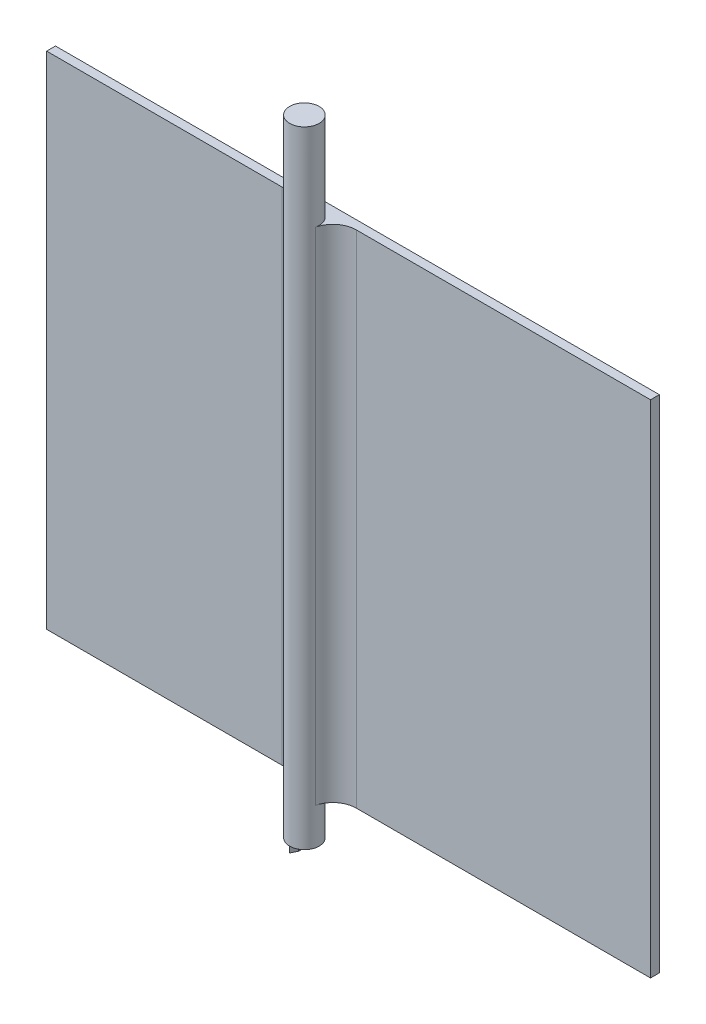
ISO-10303-21;
HEADER;
FILE_DESCRIPTION(('STEP AP214'),'2;1');
FILE_NAME('part.step','',(''),(''),'','','');
FILE_SCHEMA(('AUTOMOTIVE_DESIGN { 1 0 10303 214 1 1 1 1 }'));
ENDSEC;
DATA;
#1=APPLICATION_CONTEXT('core data for automotive mechanical design processes');
#2=APPLICATION_PROTOCOL_DEFINITION('international standard','automotive_design',2000,#1);
#3=PRODUCT_CONTEXT('',#1,'mechanical');
#4=PRODUCT('Part','Part','',(#3));
#5=PRODUCT_RELATED_PRODUCT_CATEGORY('part','',(#4));
#6=PRODUCT_DEFINITION_FORMATION('','',#4);
#7=PRODUCT_DEFINITION_CONTEXT('part definition',#1,'design');
#8=PRODUCT_DEFINITION('design','',#6,#7);
#9=PRODUCT_DEFINITION_SHAPE('','',#8);
#10=(LENGTH_UNIT() NAMED_UNIT(*) SI_UNIT(.MILLI.,.METRE.));
#11=(NAMED_UNIT(*) PLANE_ANGLE_UNIT() SI_UNIT($,.RADIAN.));
#12=(NAMED_UNIT(*) SI_UNIT($,.STERADIAN.) SOLID_ANGLE_UNIT());
#13=UNCERTAINTY_MEASURE_WITH_UNIT(LENGTH_MEASURE(1.E-05),#10,'distance_accuracy_value','');
#14=(GEOMETRIC_REPRESENTATION_CONTEXT(3) GLOBAL_UNCERTAINTY_ASSIGNED_CONTEXT((#13)) GLOBAL_UNIT_ASSIGNED_CONTEXT((#10,
#11,#12)) REPRESENTATION_CONTEXT('',''));
#15=CARTESIAN_POINT('',(0.,0.,0.));
#16=DIRECTION('',(0.,0.,1.));
#17=DIRECTION('',(1.,0.,0.));
#18=AXIS2_PLACEMENT_3D('',#15,#16,#17);
#19=CARTESIAN_POINT('',(92.5,-12.5,8.));
#20=DIRECTION('',(0.,-1.,0.));
#21=DIRECTION('',(0.,0.,-1.));
#22=AXIS2_PLACEMENT_3D('',#19,#20,#21);
#23=PLANE('',#22);
#24=DIRECTION('',(0.,0.,-1.));
#25=VECTOR('',#24,1.);
#26=CARTESIAN_POINT('',(91.5,-12.5,0.));
#27=LINE('',#26,#25);
#28=CARTESIAN_POINT('',(91.5,-12.5,11.));
#29=VERTEX_POINT('',#28);
#30=CARTESIAN_POINT('',(91.5,-12.5,5.));
#31=VERTEX_POINT('',#30);
#32=EDGE_CURVE('E207',#29,#31,#27,.T.);
#33=ORIENTED_EDGE('',*,*,#32,.F.);
#34=DIRECTION('',(0.447213595499958,0.,0.894427190999916));
#35=VECTOR('',#34,1.);
#36=CARTESIAN_POINT('',(68.8,-12.5,-34.4));
#37=LINE('',#36,#35);
#38=CARTESIAN_POINT('',(92.5,-12.5,13.));
#39=VERTEX_POINT('',#38);
#40=EDGE_CURVE('E204',#29,#39,#37,.T.);
#41=ORIENTED_EDGE('',*,*,#40,.T.);
#42=CARTESIAN_POINT('',(92.5,-12.5,8.));
#43=DIRECTION('',(0.,-1.,0.));
#44=DIRECTION('',(0.,0.,-1.));
#45=AXIS2_PLACEMENT_3D('',#42,#43,#44);
#46=CIRCLE('',#45,5.);
#47=CARTESIAN_POINT('',(92.5,-12.5,3.));
#48=VERTEX_POINT('',#47);
#49=EDGE_CURVE('E247',#39,#48,#46,.T.);
#50=ORIENTED_EDGE('',*,*,#49,.T.);
#51=DIRECTION('',(0.447213595499957,0.,-0.894427190999916));
#52=VECTOR('',#51,1.);
#53=CARTESIAN_POINT('',(75.2,-12.5,37.6));
#54=LINE('',#53,#52);
#55=EDGE_CURVE('E211',#31,#48,#54,.T.);
#56=ORIENTED_EDGE('',*,*,#55,.F.);
#57=EDGE_LOOP('',(#33,#41,#50,#56));
#58=FACE_BOUND('',#57,.T.);
#59=ADVANCED_FACE('F47',(#58),#23,.T.);
#60=EDGE_CURVE('E248',#48,#39,#46,.T.);
#61=ORIENTED_EDGE('',*,*,#60,.T.);
#62=DIRECTION('',(0.447213595499958,0.,-0.894427190999916));
#63=VECTOR('',#62,1.);
#64=CARTESIAN_POINT('',(79.2,-12.5,39.6));
#65=LINE('',#64,#63);
#66=CARTESIAN_POINT('',(93.5,-12.5,11.));
#67=VERTEX_POINT('',#66);
#68=EDGE_CURVE('E186',#39,#67,#65,.T.);
#69=ORIENTED_EDGE('',*,*,#68,.T.);
#70=DIRECTION('',(0.,0.,-1.));
#71=VECTOR('',#70,1.);
#72=CARTESIAN_POINT('',(93.5,-12.5,0.));
#73=LINE('',#72,#71);
#74=CARTESIAN_POINT('',(93.5,-12.5,5.));
#75=VERTEX_POINT('',#74);
#76=EDGE_CURVE('E219',#67,#75,#73,.T.);
#77=ORIENTED_EDGE('',*,*,#76,.T.);
#78=DIRECTION('',(0.447213595499957,0.,0.894427190999916));
#79=VECTOR('',#78,1.);
#80=CARTESIAN_POINT('',(72.8000000000001,-12.5,-36.4));
#81=LINE('',#80,#79);
#82=EDGE_CURVE('E215',#48,#75,#81,.T.);
#83=ORIENTED_EDGE('',*,*,#82,.F.);
#84=EDGE_LOOP('',(#61,#69,#77,#83));
#85=FACE_BOUND('',#84,.T.);
#86=ADVANCED_FACE('F344',(#85),#23,.T.);
#87=CARTESIAN_POINT('',(0.,170.,3.));
#88=DIRECTION('',(0.,-1.,0.));
#89=DIRECTION('',(0.,0.,-1.));
#90=AXIS2_PLACEMENT_3D('',#87,#88,#89);
#91=PLANE('',#90);
#92=CARTESIAN_POINT('',(92.5,170.,8.));
#93=DIRECTION('',(0.,1.,0.));
#94=DIRECTION('',(0.,0.,1.));
#95=AXIS2_PLACEMENT_3D('',#92,#93,#94);
#96=CIRCLE('',#95,5.);
#97=CARTESIAN_POINT('',(97.3650425541052,170.,9.15384615384615));
#98=VERTEX_POINT('',#97);
#99=CARTESIAN_POINT('',(87.6349574458948,170.,9.15384615384615));
#100=VERTEX_POINT('',#99);
#101=EDGE_CURVE('E252',#98,#100,#96,.T.);
#102=ORIENTED_EDGE('',*,*,#101,.F.);
#103=CARTESIAN_POINT('',(105.149110640674,170.,11.));
#104=DIRECTION('',(0.,-1.,0.));
#105=DIRECTION('',(0.,0.,-1.));
#106=AXIS2_PLACEMENT_3D('',#103,#104,#105);
#107=CIRCLE('',#106,8.);
#108=CARTESIAN_POINT('',(105.149110640674,170.,3.));
#109=VERTEX_POINT('',#108);
#110=EDGE_CURVE('E299',#98,#109,#107,.T.);
#111=ORIENTED_EDGE('',*,*,#110,.T.);
#112=DIRECTION('',(-1.,0.,0.));
#113=VECTOR('',#112,1.);
#114=CARTESIAN_POINT('',(0.,170.,3.));
#115=LINE('',#114,#113);
#116=CARTESIAN_POINT('',(205.,170.,3.));
#117=VERTEX_POINT('',#116);
#118=EDGE_CURVE('E272',#117,#109,#115,.T.);
#119=ORIENTED_EDGE('',*,*,#118,.F.);
#120=DIRECTION('',(0.,0.,-1.));
#121=VECTOR('',#120,1.);
#122=CARTESIAN_POINT('',(205.,170.,3.));
#123=LINE('',#122,#121);
#124=CARTESIAN_POINT('',(205.,170.,0.));
#125=VERTEX_POINT('',#124);
#126=EDGE_CURVE('E178',#117,#125,#123,.T.);
#127=ORIENTED_EDGE('',*,*,#126,.T.);
#128=DIRECTION('',(-1.,0.,0.));
#129=VECTOR('',#128,1.);
#130=CARTESIAN_POINT('',(0.,170.,0.));
#131=LINE('',#130,#129);
#132=CARTESIAN_POINT('',(0.,170.,0.));
#133=VERTEX_POINT('',#132);
#134=EDGE_CURVE('E159',#125,#133,#131,.T.);
#135=ORIENTED_EDGE('',*,*,#134,.T.);
#136=DIRECTION('',(0.,0.,-1.));
#137=VECTOR('',#136,1.);
#138=CARTESIAN_POINT('',(0.,170.,3.));
#139=LINE('',#138,#137);
#140=CARTESIAN_POINT('',(0.,170.,3.));
#141=VERTEX_POINT('',#140);
#142=EDGE_CURVE('E276',#141,#133,#139,.T.);
#143=ORIENTED_EDGE('',*,*,#142,.F.);
#144=CARTESIAN_POINT('',(79.8508893593265,170.,3.));
#145=VERTEX_POINT('',#144);
#146=EDGE_CURVE('E271',#145,#141,#115,.T.);
#147=ORIENTED_EDGE('',*,*,#146,.F.);
#148=CARTESIAN_POINT('',(79.8508893593265,170.,11.));
#149=DIRECTION('',(0.,-1.,0.));
#150=DIRECTION('',(0.,0.,-1.));
#151=AXIS2_PLACEMENT_3D('',#148,#149,#150);
#152=CIRCLE('',#151,8.);
#153=EDGE_CURVE('E56',#145,#100,#152,.T.);
#154=ORIENTED_EDGE('',*,*,#153,.T.);
#155=EDGE_LOOP('',(#102,#111,#119,#127,#135,#143,#147,#154));
#156=FACE_BOUND('',#155,.T.);
#157=ADVANCED_FACE('F308',(#156),#91,.F.);
#158=CARTESIAN_POINT('',(0.,0.,3.));
#159=DIRECTION('',(0.,0.,-1.));
#160=DIRECTION('',(-1.,0.,0.));
#161=AXIS2_PLACEMENT_3D('',#158,#159,#160);
#162=PLANE('',#161);
#163=ORIENTED_EDGE('',*,*,#118,.T.);
#164=DIRECTION('',(0.,1.,0.));
#165=VECTOR('',#164,1.);
#166=CARTESIAN_POINT('',(105.149110640674,0.,3.));
#167=LINE('',#166,#165);
#168=CARTESIAN_POINT('',(105.149110640674,0.,3.));
#169=VERTEX_POINT('',#168);
#170=EDGE_CURVE('E293',#109,#169,#167,.F.);
#171=ORIENTED_EDGE('',*,*,#170,.T.);
#172=DIRECTION('',(1.,0.,0.));
#173=VECTOR('',#172,1.);
#174=CARTESIAN_POINT('',(0.,0.,3.));
#175=LINE('',#174,#173);
#176=CARTESIAN_POINT('',(205.,0.,3.));
#177=VERTEX_POINT('',#176);
#178=EDGE_CURVE('E267',#169,#177,#175,.T.);
#179=ORIENTED_EDGE('',*,*,#178,.T.);
#180=DIRECTION('',(0.,-1.,0.));
#181=VECTOR('',#180,1.);
#182=CARTESIAN_POINT('',(205.,190.223748416157,3.));
#183=LINE('',#182,#181);
#184=EDGE_CURVE('E169',#117,#177,#183,.T.);
#185=ORIENTED_EDGE('',*,*,#184,.F.);
#186=EDGE_LOOP('',(#163,#171,#179,#185));
#187=FACE_BOUND('',#186,.T.);
#188=ADVANCED_FACE('F320',(#187),#162,.F.);
#189=CARTESIAN_POINT('',(0.,0.,3.));
#190=DIRECTION('',(1.,0.,0.));
#191=DIRECTION('',(0.,0.,-1.));
#192=AXIS2_PLACEMENT_3D('',#189,#190,#191);
#193=PLANE('',#192);
#194=DIRECTION('',(0.,-1.,0.));
#195=VECTOR('',#194,1.);
#196=CARTESIAN_POINT('',(0.,0.,0.));
#197=LINE('',#196,#195);
#198=CARTESIAN_POINT('',(0.,0.,0.));
#199=VERTEX_POINT('',#198);
#200=EDGE_CURVE('E160',#133,#199,#197,.T.);
#201=ORIENTED_EDGE('',*,*,#200,.T.);
#202=DIRECTION('',(0.,0.,-1.));
#203=VECTOR('',#202,1.);
#204=CARTESIAN_POINT('',(0.,0.,3.));
#205=LINE('',#204,#203);
#206=CARTESIAN_POINT('',(0.,0.,3.));
#207=VERTEX_POINT('',#206);
#208=EDGE_CURVE('E154',#207,#199,#205,.T.);
#209=ORIENTED_EDGE('',*,*,#208,.F.);
#210=DIRECTION('',(0.,-1.,0.));
#211=VECTOR('',#210,1.);
#212=CARTESIAN_POINT('',(0.,0.,3.));
#213=LINE('',#212,#211);
#214=EDGE_CURVE('E263',#141,#207,#213,.T.);
#215=ORIENTED_EDGE('',*,*,#214,.F.);
#216=ORIENTED_EDGE('',*,*,#142,.T.);
#217=EDGE_LOOP('',(#201,#209,#215,#216));
#218=FACE_BOUND('',#217,.T.);
#219=ADVANCED_FACE('F328',(#218),#193,.F.);
#220=CARTESIAN_POINT('',(0.,0.,3.));
#221=DIRECTION('',(0.,1.,0.));
#222=DIRECTION('',(0.,0.,1.));
#223=AXIS2_PLACEMENT_3D('',#220,#221,#222);
#224=PLANE('',#223);
#225=CARTESIAN_POINT('',(92.5,0.,8.));
#226=DIRECTION('',(0.,-1.,0.));
#227=DIRECTION('',(0.,0.,-1.));
#228=AXIS2_PLACEMENT_3D('',#225,#226,#227);
#229=CIRCLE('',#228,5.);
#230=CARTESIAN_POINT('',(87.6349574458948,0.,9.15384615384615));
#231=VERTEX_POINT('',#230);
#232=CARTESIAN_POINT('',(97.3650425541052,0.,9.15384615384615));
#233=VERTEX_POINT('',#232);
#234=EDGE_CURVE('E253',#231,#233,#229,.T.);
#235=ORIENTED_EDGE('',*,*,#234,.F.);
#236=CARTESIAN_POINT('',(79.8508893593265,0.,11.));
#237=DIRECTION('',(0.,1.,0.));
#238=DIRECTION('',(0.,0.,1.));
#239=AXIS2_PLACEMENT_3D('',#236,#237,#238);
#240=CIRCLE('',#239,8.);
#241=CARTESIAN_POINT('',(79.8508893593265,0.,3.));
#242=VERTEX_POINT('',#241);
#243=EDGE_CURVE('E11',#231,#242,#240,.T.);
#244=ORIENTED_EDGE('',*,*,#243,.T.);
#245=EDGE_CURVE('E268',#207,#242,#175,.T.);
#246=ORIENTED_EDGE('',*,*,#245,.F.);
#247=ORIENTED_EDGE('',*,*,#208,.T.);
#248=DIRECTION('',(1.,0.,0.));
#249=VECTOR('',#248,1.);
#250=CARTESIAN_POINT('',(0.,0.,0.));
#251=LINE('',#250,#249);
#252=CARTESIAN_POINT('',(205.,0.,0.));
#253=VERTEX_POINT('',#252);
#254=EDGE_CURVE('E147',#199,#253,#251,.T.);
#255=ORIENTED_EDGE('',*,*,#254,.T.);
#256=DIRECTION('',(0.,0.,1.));
#257=VECTOR('',#256,1.);
#258=CARTESIAN_POINT('',(205.,0.,3.));
#259=LINE('',#258,#257);
#260=EDGE_CURVE('E152',#253,#177,#259,.T.);
#261=ORIENTED_EDGE('',*,*,#260,.T.);
#262=ORIENTED_EDGE('',*,*,#178,.F.);
#263=CARTESIAN_POINT('',(105.149110640674,0.,11.));
#264=DIRECTION('',(0.,1.,0.));
#265=DIRECTION('',(0.,0.,1.));
#266=AXIS2_PLACEMENT_3D('',#263,#264,#265);
#267=CIRCLE('',#266,8.);
#268=EDGE_CURVE('E302',#169,#233,#267,.T.);
#269=ORIENTED_EDGE('',*,*,#268,.T.);
#270=EDGE_LOOP('',(#235,#244,#246,#247,#255,#261,#262,#269));
#271=FACE_BOUND('',#270,.T.);
#272=ADVANCED_FACE('F149',(#271),#224,.F.);
#273=ORIENTED_EDGE('',*,*,#245,.T.);
#274=DIRECTION('',(0.,1.,0.));
#275=VECTOR('',#274,1.);
#276=CARTESIAN_POINT('',(79.8508893593265,0.,3.));
#277=LINE('',#276,#275);
#278=EDGE_CURVE('E296',#242,#145,#277,.T.);
#279=ORIENTED_EDGE('',*,*,#278,.T.);
#280=ORIENTED_EDGE('',*,*,#146,.T.);
#281=ORIENTED_EDGE('',*,*,#214,.T.);
#282=EDGE_LOOP('',(#273,#279,#280,#281));
#283=FACE_BOUND('',#282,.T.);
#284=ADVANCED_FACE('F330',(#283),#162,.F.);
#285=CARTESIAN_POINT('',(0.,0.,0.));
#286=DIRECTION('',(0.,0.,-1.));
#287=DIRECTION('',(-1.,0.,0.));
#288=AXIS2_PLACEMENT_3D('',#285,#286,#287);
#289=PLANE('',#288);
#290=ORIENTED_EDGE('',*,*,#200,.F.);
#291=ORIENTED_EDGE('',*,*,#134,.F.);
#292=DIRECTION('',(0.,-1.,0.));
#293=VECTOR('',#292,1.);
#294=CARTESIAN_POINT('',(205.,190.223748416157,0.));
#295=LINE('',#294,#293);
#296=EDGE_CURVE('E163',#125,#253,#295,.T.);
#297=ORIENTED_EDGE('',*,*,#296,.T.);
#298=ORIENTED_EDGE('',*,*,#254,.F.);
#299=EDGE_LOOP('',(#290,#291,#297,#298));
#300=FACE_BOUND('',#299,.T.);
#301=ADVANCED_FACE('F164',(#300),#289,.T.);
#302=CARTESIAN_POINT('',(92.5,-14.142135623731,8.));
#303=DIRECTION('',(0.,1.,0.));
#304=DIRECTION('',(0.,0.,1.));
#305=AXIS2_PLACEMENT_3D('',#302,#303,#304);
#306=CYLINDRICAL_SURFACE('',#305,5.);
#307=DIRECTION('',(0.,1.,0.));
#308=VECTOR('',#307,1.);
#309=CARTESIAN_POINT('',(97.3650425541052,-14.142135623731,9.15384615384616));
#310=LINE('',#309,#308);
#311=EDGE_CURVE('E289',#233,#98,#310,.T.);
#312=ORIENTED_EDGE('',*,*,#311,.T.);
#313=ORIENTED_EDGE('',*,*,#101,.T.);
#314=DIRECTION('',(0.,1.,0.));
#315=VECTOR('',#314,1.);
#316=CARTESIAN_POINT('',(87.6349574458948,-14.142135623731,9.15384615384616));
#317=LINE('',#316,#315);
#318=EDGE_CURVE('E256',#100,#231,#317,.F.);
#319=ORIENTED_EDGE('',*,*,#318,.T.);
#320=ORIENTED_EDGE('',*,*,#234,.T.);
#321=EDGE_LOOP('',(#312,#313,#319,#320));
#322=FACE_BOUND('',#321,.T.);
#323=CARTESIAN_POINT('',(92.5,200.,8.));
#324=DIRECTION('',(0.,1.,0.));
#325=DIRECTION('',(0.,0.,1.));
#326=AXIS2_PLACEMENT_3D('',#323,#324,#325);
#327=CIRCLE('',#326,5.);
#328=CARTESIAN_POINT('',(92.5,200.,13.));
#329=VERTEX_POINT('',#328);
#330=EDGE_CURVE('E257',#329,#329,#327,.T.);
#331=ORIENTED_EDGE('',*,*,#330,.F.);
#332=EDGE_LOOP('',(#331));
#333=FACE_BOUND('',#332,.T.);
#334=ORIENTED_EDGE('',*,*,#60,.F.);
#335=ORIENTED_EDGE('',*,*,#49,.F.);
#336=EDGE_LOOP('',(#334,#335));
#337=FACE_BOUND('',#336,.T.);
#338=ADVANCED_FACE('F312',(#322,#333,#337),#306,.T.);
#339=CARTESIAN_POINT('',(92.5,200.,8.));
#340=DIRECTION('',(0.,1.,0.));
#341=DIRECTION('',(0.,0.,1.));
#342=AXIS2_PLACEMENT_3D('',#339,#340,#341);
#343=PLANE('',#342);
#344=ORIENTED_EDGE('',*,*,#330,.T.);
#345=EDGE_LOOP('',(#344));
#346=FACE_BOUND('',#345,.T.);
#347=ADVANCED_FACE('F356',(#346),#343,.T.);
#348=CARTESIAN_POINT('',(68.8,-14.5,-34.4));
#349=DIRECTION('',(-0.894427190999916,0.,0.447213595499958));
#350=DIRECTION('',(0.447213595499958,0.,0.894427190999916));
#351=AXIS2_PLACEMENT_3D('',#348,#349,#350);
#352=PLANE('',#351);
#353=ORIENTED_EDGE('',*,*,#40,.F.);
#354=DIRECTION('',(0.,1.,0.));
#355=VECTOR('',#354,1.);
#356=CARTESIAN_POINT('',(91.5,-14.5,11.));
#357=LINE('',#356,#355);
#358=CARTESIAN_POINT('',(91.5,-14.5,11.));
#359=VERTEX_POINT('',#358);
#360=EDGE_CURVE('E243',#359,#29,#357,.T.);
#361=ORIENTED_EDGE('',*,*,#360,.F.);
#362=DIRECTION('',(0.447213595499958,0.,0.894427190999916));
#363=VECTOR('',#362,1.);
#364=CARTESIAN_POINT('',(68.8,-14.5,-34.4));
#365=LINE('',#364,#363);
#366=CARTESIAN_POINT('',(92.5,-14.5,13.));
#367=VERTEX_POINT('',#366);
#368=EDGE_CURVE('E181',#359,#367,#365,.T.);
#369=ORIENTED_EDGE('',*,*,#368,.T.);
#370=DIRECTION('',(0.,1.,0.));
#371=VECTOR('',#370,1.);
#372=CARTESIAN_POINT('',(92.5,-14.5,13.));
#373=LINE('',#372,#371);
#374=EDGE_CURVE('E203',#367,#39,#373,.T.);
#375=ORIENTED_EDGE('',*,*,#374,.T.);
#376=EDGE_LOOP('',(#353,#361,#369,#375));
#377=FACE_BOUND('',#376,.T.);
#378=ADVANCED_FACE('F354',(#377),#352,.T.);
#379=CARTESIAN_POINT('',(91.5,-14.5,0.));
#380=DIRECTION('',(1.,0.,0.));
#381=DIRECTION('',(0.,0.,-1.));
#382=AXIS2_PLACEMENT_3D('',#379,#380,#381);
#383=PLANE('',#382);
#384=ORIENTED_EDGE('',*,*,#32,.T.);
#385=DIRECTION('',(0.,1.,0.));
#386=VECTOR('',#385,1.);
#387=CARTESIAN_POINT('',(91.5,-14.5,5.));
#388=LINE('',#387,#386);
#389=CARTESIAN_POINT('',(91.5,-14.5,5.));
#390=VERTEX_POINT('',#389);
#391=EDGE_CURVE('E239',#390,#31,#388,.T.);
#392=ORIENTED_EDGE('',*,*,#391,.F.);
#393=DIRECTION('',(0.,0.,-1.));
#394=VECTOR('',#393,1.);
#395=CARTESIAN_POINT('',(91.5,-14.5,0.));
#396=LINE('',#395,#394);
#397=EDGE_CURVE('E185',#359,#390,#396,.T.);
#398=ORIENTED_EDGE('',*,*,#397,.F.);
#399=ORIENTED_EDGE('',*,*,#360,.T.);
#400=EDGE_LOOP('',(#384,#392,#398,#399));
#401=FACE_BOUND('',#400,.T.);
#402=ADVANCED_FACE('F450',(#401),#383,.F.);
#403=CARTESIAN_POINT('',(75.2,-14.5,37.6));
#404=DIRECTION('',(0.894427190999916,0.,0.447213595499957));
#405=DIRECTION('',(0.447213595499957,0.,-0.894427190999916));
#406=AXIS2_PLACEMENT_3D('',#403,#404,#405);
#407=PLANE('',#406);
#408=ORIENTED_EDGE('',*,*,#55,.T.);
#409=DIRECTION('',(0.,1.,0.));
#410=VECTOR('',#409,1.);
#411=CARTESIAN_POINT('',(92.5,-14.5,3.));
#412=LINE('',#411,#410);
#413=CARTESIAN_POINT('',(92.5,-14.5,3.));
#414=VERTEX_POINT('',#413);
#415=EDGE_CURVE('E235',#414,#48,#412,.T.);
#416=ORIENTED_EDGE('',*,*,#415,.F.);
#417=DIRECTION('',(0.447213595499957,0.,-0.894427190999916));
#418=VECTOR('',#417,1.);
#419=CARTESIAN_POINT('',(75.2,-14.5,37.6));
#420=LINE('',#419,#418);
#421=EDGE_CURVE('E189',#390,#414,#420,.T.);
#422=ORIENTED_EDGE('',*,*,#421,.F.);
#423=ORIENTED_EDGE('',*,*,#391,.T.);
#424=EDGE_LOOP('',(#408,#416,#422,#423));
#425=FACE_BOUND('',#424,.T.);
#426=ADVANCED_FACE('F441',(#425),#407,.F.);
#427=CARTESIAN_POINT('',(72.8000000000001,-14.5,-36.4));
#428=DIRECTION('',(-0.894427190999916,0.,0.447213595499957));
#429=DIRECTION('',(0.447213595499957,0.,0.894427190999916));
#430=AXIS2_PLACEMENT_3D('',#427,#428,#429);
#431=PLANE('',#430);
#432=ORIENTED_EDGE('',*,*,#82,.T.);
#433=DIRECTION('',(0.,1.,0.));
#434=VECTOR('',#433,1.);
#435=CARTESIAN_POINT('',(93.5,-14.5,5.));
#436=LINE('',#435,#434);
#437=CARTESIAN_POINT('',(93.5,-14.5,5.));
#438=VERTEX_POINT('',#437);
#439=EDGE_CURVE('E231',#438,#75,#436,.T.);
#440=ORIENTED_EDGE('',*,*,#439,.F.);
#441=DIRECTION('',(0.447213595499957,0.,0.894427190999916));
#442=VECTOR('',#441,1.);
#443=CARTESIAN_POINT('',(72.8000000000001,-14.5,-36.4));
#444=LINE('',#443,#442);
#445=EDGE_CURVE('E192',#414,#438,#444,.T.);
#446=ORIENTED_EDGE('',*,*,#445,.F.);
#447=ORIENTED_EDGE('',*,*,#415,.T.);
#448=EDGE_LOOP('',(#432,#440,#446,#447));
#449=FACE_BOUND('',#448,.T.);
#450=ADVANCED_FACE('F432',(#449),#431,.F.);
#451=CARTESIAN_POINT('',(93.5,-14.5,0.));
#452=DIRECTION('',(1.,0.,0.));
#453=DIRECTION('',(0.,0.,-1.));
#454=AXIS2_PLACEMENT_3D('',#451,#452,#453);
#455=PLANE('',#454);
#456=ORIENTED_EDGE('',*,*,#76,.F.);
#457=DIRECTION('',(0.,1.,0.));
#458=VECTOR('',#457,1.);
#459=CARTESIAN_POINT('',(93.5,-14.5,11.));
#460=LINE('',#459,#458);
#461=CARTESIAN_POINT('',(93.5,-14.5,11.));
#462=VERTEX_POINT('',#461);
#463=EDGE_CURVE('E227',#462,#67,#460,.T.);
#464=ORIENTED_EDGE('',*,*,#463,.F.);
#465=DIRECTION('',(0.,0.,-1.));
#466=VECTOR('',#465,1.);
#467=CARTESIAN_POINT('',(93.5,-14.5,0.));
#468=LINE('',#467,#466);
#469=EDGE_CURVE('E195',#462,#438,#468,.T.);
#470=ORIENTED_EDGE('',*,*,#469,.T.);
#471=ORIENTED_EDGE('',*,*,#439,.T.);
#472=EDGE_LOOP('',(#456,#464,#470,#471));
#473=FACE_BOUND('',#472,.T.);
#474=ADVANCED_FACE('F423',(#473),#455,.T.);
#475=CARTESIAN_POINT('',(79.2,-14.5,39.6));
#476=DIRECTION('',(0.894427190999916,0.,0.447213595499958));
#477=DIRECTION('',(0.447213595499958,0.,-0.894427190999916));
#478=AXIS2_PLACEMENT_3D('',#475,#476,#477);
#479=PLANE('',#478);
#480=ORIENTED_EDGE('',*,*,#68,.F.);
#481=ORIENTED_EDGE('',*,*,#374,.F.);
#482=DIRECTION('',(0.447213595499958,0.,-0.894427190999916));
#483=VECTOR('',#482,1.);
#484=CARTESIAN_POINT('',(79.2,-14.5,39.6));
#485=LINE('',#484,#483);
#486=EDGE_CURVE('E199',#367,#462,#485,.T.);
#487=ORIENTED_EDGE('',*,*,#486,.T.);
#488=ORIENTED_EDGE('',*,*,#463,.T.);
#489=EDGE_LOOP('',(#480,#481,#487,#488));
#490=FACE_BOUND('',#489,.T.);
#491=ADVANCED_FACE('F414',(#490),#479,.T.);
#492=CARTESIAN_POINT('',(0.,-14.5,0.));
#493=DIRECTION('',(0.,-1.,0.));
#494=DIRECTION('',(0.,0.,-1.));
#495=AXIS2_PLACEMENT_3D('',#492,#493,#494);
#496=PLANE('',#495);
#497=ORIENTED_EDGE('',*,*,#368,.F.);
#498=ORIENTED_EDGE('',*,*,#397,.T.);
#499=ORIENTED_EDGE('',*,*,#421,.T.);
#500=ORIENTED_EDGE('',*,*,#445,.T.);
#501=ORIENTED_EDGE('',*,*,#469,.F.);
#502=ORIENTED_EDGE('',*,*,#486,.F.);
#503=EDGE_LOOP('',(#497,#498,#499,#500,#501,#502));
#504=FACE_BOUND('',#503,.T.);
#505=ADVANCED_FACE('F369',(#504),#496,.T.);
#506=CARTESIAN_POINT('',(105.149110640674,-14.142135623731,11.));
#507=DIRECTION('',(0.,1.,0.));
#508=DIRECTION('',(0.,0.,1.));
#509=AXIS2_PLACEMENT_3D('',#506,#507,#508);
#510=CYLINDRICAL_SURFACE('',#509,8.);
#511=ORIENTED_EDGE('',*,*,#268,.F.);
#512=ORIENTED_EDGE('',*,*,#170,.F.);
#513=ORIENTED_EDGE('',*,*,#110,.F.);
#514=ORIENTED_EDGE('',*,*,#311,.F.);
#515=EDGE_LOOP('',(#511,#512,#513,#514));
#516=FACE_BOUND('',#515,.T.);
#517=ADVANCED_FACE('F317',(#516),#510,.F.);
#518=CARTESIAN_POINT('',(79.8508893593265,-14.142135623731,11.));
#519=DIRECTION('',(0.,1.,0.));
#520=DIRECTION('',(0.,0.,1.));
#521=AXIS2_PLACEMENT_3D('',#518,#519,#520);
#522=CYLINDRICAL_SURFACE('',#521,8.);
#523=ORIENTED_EDGE('',*,*,#243,.F.);
#524=ORIENTED_EDGE('',*,*,#318,.F.);
#525=ORIENTED_EDGE('',*,*,#153,.F.);
#526=ORIENTED_EDGE('',*,*,#278,.F.);
#527=EDGE_LOOP('',(#523,#524,#525,#526));
#528=FACE_BOUND('',#527,.T.);
#529=ADVANCED_FACE('F49',(#528),#522,.F.);
#530=CARTESIAN_POINT('',(205.,190.223748416157,3.));
#531=DIRECTION('',(1.,0.,0.));
#532=DIRECTION('',(0.,0.,-1.));
#533=AXIS2_PLACEMENT_3D('',#530,#531,#532);
#534=PLANE('',#533);
#535=ORIENTED_EDGE('',*,*,#126,.F.);
#536=ORIENTED_EDGE('',*,*,#184,.T.);
#537=ORIENTED_EDGE('',*,*,#260,.F.);
#538=ORIENTED_EDGE('',*,*,#296,.F.);
#539=EDGE_LOOP('',(#535,#536,#537,#538));
#540=FACE_BOUND('',#539,.T.);
#541=ADVANCED_FACE('F172',(#540),#534,.T.);
#542=CLOSED_SHELL('',(#59,#86,#157,#188,#219,#272,#284,#301,#338,#347,#378,#402,#426,#450,#474,
#491,#505,#517,#529,#541));
#543=MANIFOLD_SOLID_BREP('B2',#542);
#544=ADVANCED_BREP_SHAPE_REPRESENTATION('',(#18,#543),#14);
#545=SHAPE_DEFINITION_REPRESENTATION(#9,#544);
ENDSEC;
END-ISO-10303-21;
